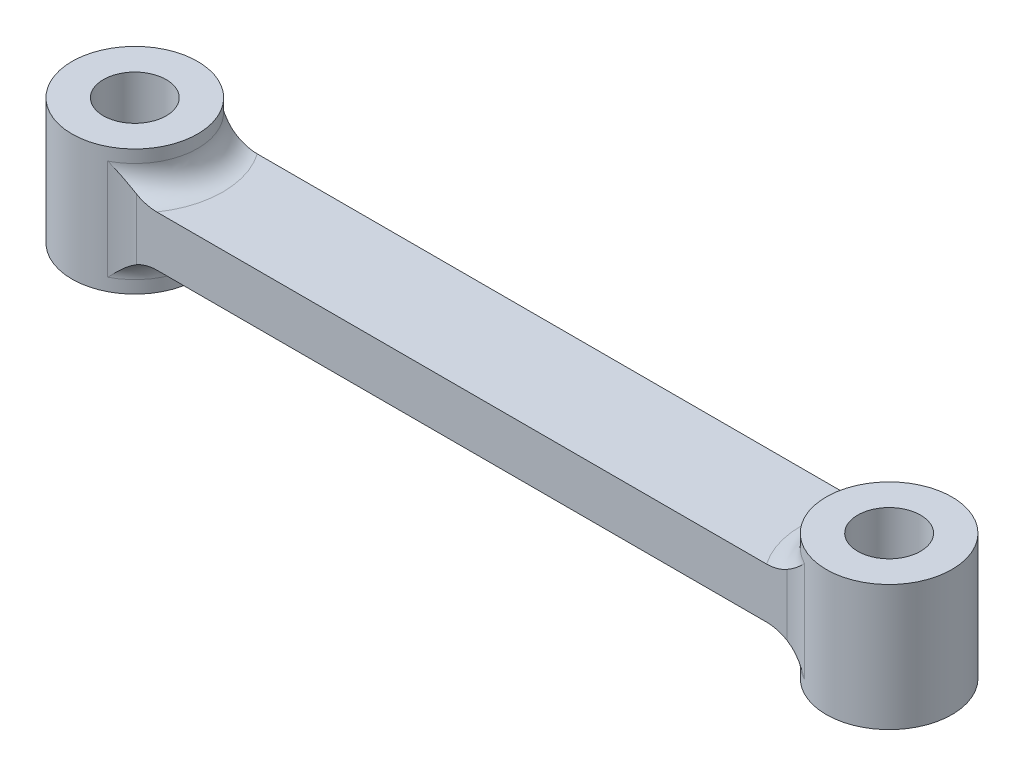
ISO-10303-21;
HEADER;
FILE_DESCRIPTION(('STEP AP214'),'2;1');
FILE_NAME('part.step','',(''),(''),'','','');
FILE_SCHEMA(('AUTOMOTIVE_DESIGN { 1 0 10303 214 1 1 1 1 }'));
ENDSEC;
DATA;
#1=APPLICATION_CONTEXT('core data for automotive mechanical design processes');
#2=APPLICATION_PROTOCOL_DEFINITION('international standard','automotive_design',2000,#1);
#3=PRODUCT_CONTEXT('',#1,'mechanical');
#4=PRODUCT('Part','Part','',(#3));
#5=PRODUCT_RELATED_PRODUCT_CATEGORY('part','',(#4));
#6=PRODUCT_DEFINITION_FORMATION('','',#4);
#7=PRODUCT_DEFINITION_CONTEXT('part definition',#1,'design');
#8=PRODUCT_DEFINITION('design','',#6,#7);
#9=PRODUCT_DEFINITION_SHAPE('','',#8);
#10=(LENGTH_UNIT() NAMED_UNIT(*) SI_UNIT(.MILLI.,.METRE.));
#11=(NAMED_UNIT(*) PLANE_ANGLE_UNIT() SI_UNIT($,.RADIAN.));
#12=(NAMED_UNIT(*) SI_UNIT($,.STERADIAN.) SOLID_ANGLE_UNIT());
#13=UNCERTAINTY_MEASURE_WITH_UNIT(LENGTH_MEASURE(1.E-05),#10,'distance_accuracy_value','');
#14=(GEOMETRIC_REPRESENTATION_CONTEXT(3) GLOBAL_UNCERTAINTY_ASSIGNED_CONTEXT((#13)) GLOBAL_UNIT_ASSIGNED_CONTEXT((#10,
#11,#12)) REPRESENTATION_CONTEXT('',''));
#15=CARTESIAN_POINT('',(0.,0.,0.));
#16=DIRECTION('',(0.,0.,1.));
#17=DIRECTION('',(1.,0.,0.));
#18=AXIS2_PLACEMENT_3D('',#15,#16,#17);
#19=CARTESIAN_POINT('',(0.,2.,0.));
#20=DIRECTION('',(0.,1.,0.));
#21=DIRECTION('',(0.,0.,1.));
#22=AXIS2_PLACEMENT_3D('',#19,#20,#21);
#23=PLANE('',#22);
#24=DIRECTION('',(-1.,0.,0.));
#25=VECTOR('',#24,1.);
#26=CARTESIAN_POINT('',(0.,2.,4.));
#27=LINE('',#26,#25);
#28=CARTESIAN_POINT('',(24.255437353462,2.,4.));
#29=VERTEX_POINT('',#28);
#30=CARTESIAN_POINT('',(-24.255437353462,2.,4.));
#31=VERTEX_POINT('',#30);
#32=EDGE_CURVE('E153',#29,#31,#27,.T.);
#33=ORIENTED_EDGE('',*,*,#32,.F.);
#34=CARTESIAN_POINT('',(30.,2.,0.));
#35=DIRECTION('',(0.,1.,0.));
#36=DIRECTION('',(0.,0.,1.));
#37=AXIS2_PLACEMENT_3D('',#34,#35,#36);
#38=CIRCLE('',#37,7.);
#39=CARTESIAN_POINT('',(24.255437353462,2.,-4.));
#40=VERTEX_POINT('',#39);
#41=EDGE_CURVE('E138',#29,#40,#38,.F.);
#42=ORIENTED_EDGE('',*,*,#41,.T.);
#43=DIRECTION('',(-1.,0.,0.));
#44=VECTOR('',#43,1.);
#45=CARTESIAN_POINT('',(0.,2.,-4.));
#46=LINE('',#45,#44);
#47=CARTESIAN_POINT('',(-24.255437353462,2.,-3.99999999999999));
#48=VERTEX_POINT('',#47);
#49=EDGE_CURVE('E150',#40,#48,#46,.T.);
#50=ORIENTED_EDGE('',*,*,#49,.T.);
#51=CARTESIAN_POINT('',(-30.,2.,0.));
#52=DIRECTION('',(0.,1.,0.));
#53=DIRECTION('',(0.,0.,1.));
#54=AXIS2_PLACEMENT_3D('',#51,#52,#53);
#55=CIRCLE('',#54,7.);
#56=EDGE_CURVE('E155',#48,#31,#55,.F.);
#57=ORIENTED_EDGE('',*,*,#56,.T.);
#58=EDGE_LOOP('',(#33,#42,#50,#57));
#59=FACE_BOUND('',#58,.T.);
#60=ADVANCED_FACE('F37',(#59),#23,.T.);
#61=CARTESIAN_POINT('',(0.,-2.,0.));
#62=DIRECTION('',(0.,1.,0.));
#63=DIRECTION('',(0.,0.,1.));
#64=AXIS2_PLACEMENT_3D('',#61,#62,#63);
#65=PLANE('',#64);
#66=DIRECTION('',(-1.,0.,0.));
#67=VECTOR('',#66,1.);
#68=CARTESIAN_POINT('',(0.,-2.,-4.));
#69=LINE('',#68,#67);
#70=CARTESIAN_POINT('',(24.255437353462,-2.,-4.));
#71=VERTEX_POINT('',#70);
#72=CARTESIAN_POINT('',(-24.255437353462,-2.,-3.99999999999999));
#73=VERTEX_POINT('',#72);
#74=EDGE_CURVE('E165',#71,#73,#69,.T.);
#75=ORIENTED_EDGE('',*,*,#74,.F.);
#76=CARTESIAN_POINT('',(30.,-2.,0.));
#77=DIRECTION('',(0.,1.,0.));
#78=DIRECTION('',(0.,0.,1.));
#79=AXIS2_PLACEMENT_3D('',#76,#77,#78);
#80=CIRCLE('',#79,7.);
#81=CARTESIAN_POINT('',(24.255437353462,-2.,4.));
#82=VERTEX_POINT('',#81);
#83=EDGE_CURVE('E195',#71,#82,#80,.T.);
#84=ORIENTED_EDGE('',*,*,#83,.T.);
#85=DIRECTION('',(-1.,0.,0.));
#86=VECTOR('',#85,1.);
#87=CARTESIAN_POINT('',(0.,-2.,4.));
#88=LINE('',#87,#86);
#89=CARTESIAN_POINT('',(-24.255437353462,-2.,4.));
#90=VERTEX_POINT('',#89);
#91=EDGE_CURVE('E160',#82,#90,#88,.T.);
#92=ORIENTED_EDGE('',*,*,#91,.T.);
#93=CARTESIAN_POINT('',(-30.,-2.,0.));
#94=DIRECTION('',(0.,1.,0.));
#95=DIRECTION('',(0.,0.,1.));
#96=AXIS2_PLACEMENT_3D('',#93,#94,#95);
#97=CIRCLE('',#96,7.);
#98=EDGE_CURVE('E193',#90,#73,#97,.T.);
#99=ORIENTED_EDGE('',*,*,#98,.T.);
#100=EDGE_LOOP('',(#75,#84,#92,#99));
#101=FACE_BOUND('',#100,.T.);
#102=ADVANCED_FACE('F356',(#101),#65,.F.);
#103=CARTESIAN_POINT('',(25.8768943743823,2.,-8.));
#104=DIRECTION('',(0.,-1.,0.));
#105=DIRECTION('',(0.,0.,-1.));
#106=AXIS2_PLACEMENT_3D('',#103,#104,#105);
#107=CYLINDRICAL_SURFACE('',#106,4.);
#108=DIRECTION('',(0.,-1.,0.));
#109=VECTOR('',#108,1.);
#110=CARTESIAN_POINT('',(27.7093857635458,2.,-4.44444444444445));
#111=LINE('',#110,#109);
#112=CARTESIAN_POINT('',(27.7093857635458,4.,-4.44444444444445));
#113=VERTEX_POINT('',#112);
#114=CARTESIAN_POINT('',(27.7093857635458,-4.,-4.44444444444445));
#115=VERTEX_POINT('',#114);
#116=EDGE_CURVE('E162',#113,#115,#111,.T.);
#117=ORIENTED_EDGE('',*,*,#116,.T.);
#118=CARTESIAN_POINT('',(25.8768943743823,-2.44311944853179,-4.));
#119=CARTESIAN_POINT('',(25.9297746648206,-2.47372776459844,-4.00000196993777));
#120=CARTESIAN_POINT('',(25.9820268535978,-2.50538292882221,-4.00104838152717));
#121=CARTESIAN_POINT('',(26.0852688929575,-2.57052552649921,-4.00509689372207));
#122=CARTESIAN_POINT('',(26.1362592907939,-2.60401214465675,-4.00809813049912));
#123=CARTESIAN_POINT('',(26.2871761873936,-2.70671865821983,-4.01981872665788));
#124=CARTESIAN_POINT('',(26.3852807237515,-2.77832197612055,-4.03125616453968));
#125=CARTESIAN_POINT('',(26.5763074819203,-2.92579459635884,-4.06044308734516));
#126=CARTESIAN_POINT('',(26.6692552234867,-3.00163828863825,-4.07815753405037));
#127=CARTESIAN_POINT('',(26.8510157261602,-3.15671370740922,-4.1193082213558));
#128=CARTESIAN_POINT('',(26.9398264535234,-3.23594706428874,-4.14274724151965));
#129=CARTESIAN_POINT('',(27.1458070001983,-3.42637903978097,-4.2045646515911));
#130=CARTESIAN_POINT('',(27.2613470152071,-3.53858309793674,-4.24526407735));
#131=CARTESIAN_POINT('',(27.4865322009621,-3.76503356044029,-4.33614964924116));
#132=CARTESIAN_POINT('',(27.596177317845,-3.87927998343696,-4.38633588203782));
#133=CARTESIAN_POINT('',(27.7053316291044,-3.99567410659977,-4.44235719341808));
#134=CARTESIAN_POINT('',(27.7073591464804,-3.99783705955152,-4.44339995935357));
#135=CARTESIAN_POINT('',(27.7093857635458,-4.,-4.44444444444444));
#136=B_SPLINE_CURVE_WITH_KNOTS('',3,(#118,#119,#120,#121,#122,#123,#124,#125,#126,#127,#128,
#129,#130,#131,#132,#133,#134,#135),.UNSPECIFIED.,.F.,.F.,(4,2,2,2,2,2,2,2,4),(0.,
0.18324758445202,0.366414247509591,0.731941901421137,1.09546051720547,1.45915599139702,
1.95707222813002,2.45499301367486,2.46442110590508),.UNSPECIFIED.);
#137=CARTESIAN_POINT('',(25.8768943743823,-2.44311944853179,-4.));
#138=VERTEX_POINT('',#137);
#139=EDGE_CURVE('E339',#115,#138,#136,.F.);
#140=ORIENTED_EDGE('',*,*,#139,.T.);
#141=DIRECTION('',(0.,-1.,0.));
#142=VECTOR('',#141,1.);
#143=CARTESIAN_POINT('',(25.8768943743823,2.,-4.));
#144=LINE('',#143,#142);
#145=CARTESIAN_POINT('',(25.8768943743823,2.44311944853179,-4.));
#146=VERTEX_POINT('',#145);
#147=EDGE_CURVE('E185',#146,#138,#144,.T.);
#148=ORIENTED_EDGE('',*,*,#147,.F.);
#149=CARTESIAN_POINT('',(25.8768943743823,2.44311944853179,-4.));
#150=CARTESIAN_POINT('',(25.9297746648206,2.47372776459844,-4.00000196993777));
#151=CARTESIAN_POINT('',(25.9820268535978,2.50538292882221,-4.00104838152717));
#152=CARTESIAN_POINT('',(26.0852688929575,2.57052552649921,-4.00509689372207));
#153=CARTESIAN_POINT('',(26.1362592907939,2.60401214465675,-4.00809813049912));
#154=CARTESIAN_POINT('',(26.2871761873936,2.70671865821983,-4.01981872665788));
#155=CARTESIAN_POINT('',(26.3852807237515,2.77832197612055,-4.03125616453968));
#156=CARTESIAN_POINT('',(26.5763074819203,2.92579459635884,-4.06044308734516));
#157=CARTESIAN_POINT('',(26.6692552234867,3.00163828863825,-4.07815753405037));
#158=CARTESIAN_POINT('',(26.8510157261602,3.15671370740922,-4.1193082213558));
#159=CARTESIAN_POINT('',(26.9398264535234,3.23594706428874,-4.14274724151965));
#160=CARTESIAN_POINT('',(27.1458070001983,3.42637903978097,-4.2045646515911));
#161=CARTESIAN_POINT('',(27.2613470152071,3.53858309793674,-4.24526407735));
#162=CARTESIAN_POINT('',(27.4865322009621,3.76503356044029,-4.33614964924116));
#163=CARTESIAN_POINT('',(27.596177317845,3.87927998343696,-4.38633588203782));
#164=CARTESIAN_POINT('',(27.7053316291044,3.99567410659977,-4.44235719341808));
#165=CARTESIAN_POINT('',(27.7073591464804,3.99783705955152,-4.44339995935357));
#166=CARTESIAN_POINT('',(27.7093857635458,4.,-4.44444444444444));
#167=B_SPLINE_CURVE_WITH_KNOTS('',3,(#149,#150,#151,#152,#153,#154,#155,#156,#157,#158,#159,
#160,#161,#162,#163,#164,#165,#166),.UNSPECIFIED.,.F.,.F.,(4,2,2,2,2,2,2,2,4),(0.,
0.18324758445202,0.366414247509591,0.731941901421137,1.09546051720547,1.45915599139702,
1.95707222813002,2.45499301367486,2.46442110590508),.UNSPECIFIED.);
#168=EDGE_CURVE('E141',#146,#113,#167,.T.);
#169=ORIENTED_EDGE('',*,*,#168,.T.);
#170=EDGE_LOOP('',(#117,#140,#148,#169));
#171=FACE_BOUND('',#170,.T.);
#172=ADVANCED_FACE('F353',(#171),#107,.F.);
#173=CARTESIAN_POINT('',(0.,2.,-4.));
#174=DIRECTION('',(0.,0.,1.));
#175=DIRECTION('',(1.,0.,0.));
#176=AXIS2_PLACEMENT_3D('',#173,#174,#175);
#177=PLANE('',#176);
#178=ORIENTED_EDGE('',*,*,#147,.T.);
#179=CARTESIAN_POINT('',(25.8768943743823,-2.44311944853179,-4.));
#180=CARTESIAN_POINT('',(25.8028940293543,-2.40031307907234,-4.));
#181=CARTESIAN_POINT('',(25.7272214194364,-2.36041710182163,-4.));
#182=CARTESIAN_POINT('',(25.573006448851,-2.28656396245982,-4.));
#183=CARTESIAN_POINT('',(25.4944633589237,-2.25260832237957,-4.));
#184=CARTESIAN_POINT('',(25.3366024661627,-2.19138938342797,-4.));
#185=CARTESIAN_POINT('',(25.2573309607058,-2.16400665989232,-4.));
#186=CARTESIAN_POINT('',(25.0969764276201,-2.11529280431822,-4.));
#187=CARTESIAN_POINT('',(25.0158938512238,-2.09396018263259,-4.));
#188=CARTESIAN_POINT('',(24.8235455766396,-2.05118194693289,-4.));
#189=CARTESIAN_POINT('',(24.711687895434,-2.03233200401126,-4.));
#190=CARTESIAN_POINT('',(24.4850643988364,-2.00666016952282,-4.));
#191=CARTESIAN_POINT('',(24.3702797277634,-2.00000586442007,-4.));
#192=CARTESIAN_POINT('',(24.255437353462,-2.,-4.));
#193=B_SPLINE_CURVE_WITH_KNOTS('',3,(#179,#180,#181,#182,#183,#184,#185,#186,#187,#188,#189,
#190,#191,#192),.UNSPECIFIED.,.F.,.F.,(4,2,2,2,2,2,4),(0.,0.256388070157113,0.512841736058818,
0.764206669153215,1.01550965770467,1.35514048823286,1.69940433873517),.UNSPECIFIED.);
#194=EDGE_CURVE('E341',#138,#71,#193,.T.);
#195=ORIENTED_EDGE('',*,*,#194,.T.);
#196=ORIENTED_EDGE('',*,*,#74,.T.);
#197=CARTESIAN_POINT('',(-24.255437353462,-2.,-3.99999999999999));
#198=CARTESIAN_POINT('',(-24.3411491011881,-2.00000698154822,-3.99999999999999));
#199=CARTESIAN_POINT('',(-24.4267964362276,-2.0037106976294,-3.99999999999999));
#200=CARTESIAN_POINT('',(-24.5974637365262,-2.01820468756952,-3.99999999999999));
#201=CARTESIAN_POINT('',(-24.6824839050069,-2.02899255385296,-3.99999999999999));
#202=CARTESIAN_POINT('',(-24.9325226619659,-2.07095213548474,-3.99999999999999));
#203=CARTESIAN_POINT('',(-25.0960262215751,-2.11175040809518,-3.99999999999999));
#204=CARTESIAN_POINT('',(-25.3627150807588,-2.19997661663279,-3.99999999999999));
#205=CARTESIAN_POINT('',(-25.4681394349545,-2.24087288772786,-3.99999999999999));
#206=CARTESIAN_POINT('',(-25.6234640900527,-2.31033453105478,-3.99999999999999));
#207=CARTESIAN_POINT('',(-25.6751050690071,-2.33503380760382,-3.99999999999999));
#208=CARTESIAN_POINT('',(-25.7770466371054,-2.3870897541493,-3.99999999999999));
#209=CARTESIAN_POINT('',(-25.8273468665345,-2.41444712833164,-3.99999999999999));
#210=CARTESIAN_POINT('',(-25.8768943743817,-2.44311944853382,-3.99999999999999));
#211=B_SPLINE_CURVE_WITH_KNOTS('',3,(#197,#198,#199,#200,#201,#202,#203,#204,#205,#206,#207,
#208,#209,#210),.UNSPECIFIED.,.F.,.F.,(4,2,2,2,2,2,4),(0.,0.256941042069846,0.513794806905946,
1.01710137669416,1.35580786664483,1.52746636151208,1.69917045696184),.UNSPECIFIED.);
#212=CARTESIAN_POINT('',(-25.8768943743823,-2.44311944853178,-3.99999999999999));
#213=VERTEX_POINT('',#212);
#214=EDGE_CURVE('E51',#73,#213,#211,.T.);
#215=ORIENTED_EDGE('',*,*,#214,.T.);
#216=DIRECTION('',(0.,-1.,0.));
#217=VECTOR('',#216,1.);
#218=CARTESIAN_POINT('',(-25.8768943743823,2.,-3.99999999999999));
#219=LINE('',#218,#217);
#220=CARTESIAN_POINT('',(-25.8768943743823,2.44311944853178,-3.99999999999999));
#221=VERTEX_POINT('',#220);
#222=EDGE_CURVE('E57',#221,#213,#219,.T.);
#223=ORIENTED_EDGE('',*,*,#222,.F.);
#224=CARTESIAN_POINT('',(-25.8768943743823,2.44311944853178,-3.99999999999999));
#225=CARTESIAN_POINT('',(-25.8028940293543,2.40031307907233,-3.99999999999999));
#226=CARTESIAN_POINT('',(-25.7272214194364,2.36041710182162,-3.99999999999999));
#227=CARTESIAN_POINT('',(-25.5730064488509,2.28656396245982,-3.99999999999999));
#228=CARTESIAN_POINT('',(-25.4944633589237,2.25260832237956,-3.99999999999999));
#229=CARTESIAN_POINT('',(-25.3366024661627,2.19138938342796,-3.99999999999999));
#230=CARTESIAN_POINT('',(-25.2573309607057,2.16400665989231,-3.99999999999999));
#231=CARTESIAN_POINT('',(-25.0969764276201,2.11529280431822,-3.99999999999999));
#232=CARTESIAN_POINT('',(-25.0158938512237,2.09396018263258,-3.99999999999999));
#233=CARTESIAN_POINT('',(-24.8235455766396,2.05118194693288,-3.99999999999999));
#234=CARTESIAN_POINT('',(-24.7116878954339,2.03233200401126,-3.99999999999999));
#235=CARTESIAN_POINT('',(-24.4850643988363,2.00666016952282,-3.99999999999999));
#236=CARTESIAN_POINT('',(-24.3702797277634,2.00000586442007,-3.99999999999999));
#237=CARTESIAN_POINT('',(-24.255437353462,2.,-3.99999999999999));
#238=B_SPLINE_CURVE_WITH_KNOTS('',3,(#224,#225,#226,#227,#228,#229,#230,#231,#232,#233,#234,
#235,#236,#237),.UNSPECIFIED.,.F.,.F.,(4,2,2,2,2,2,4),(0.,0.256388070157112,0.512841736058817,
0.764206669153221,1.01550965770467,1.35514048823286,1.69940433873516),.UNSPECIFIED.);
#239=EDGE_CURVE('E159',#221,#48,#238,.T.);
#240=ORIENTED_EDGE('',*,*,#239,.T.);
#241=ORIENTED_EDGE('',*,*,#49,.F.);
#242=CARTESIAN_POINT('',(24.255437353462,2.,-4.));
#243=CARTESIAN_POINT('',(24.3411491011881,2.00000698154822,-4.));
#244=CARTESIAN_POINT('',(24.4267964362276,2.0037106976294,-4.));
#245=CARTESIAN_POINT('',(24.5974637365262,2.01820468756952,-4.));
#246=CARTESIAN_POINT('',(24.6824839050069,2.02899255385296,-4.));
#247=CARTESIAN_POINT('',(24.9325226619659,2.07095213548474,-4.));
#248=CARTESIAN_POINT('',(25.0960262215751,2.11175040809518,-4.));
#249=CARTESIAN_POINT('',(25.3627150807588,2.1999766166328,-4.));
#250=CARTESIAN_POINT('',(25.4681394349545,2.24087288772786,-4.));
#251=CARTESIAN_POINT('',(25.6234640900528,2.31033453105478,-4.));
#252=CARTESIAN_POINT('',(25.6751050690071,2.33503380760382,-4.));
#253=CARTESIAN_POINT('',(25.7770466371055,2.38708975414931,-4.));
#254=CARTESIAN_POINT('',(25.8273468665346,2.41444712833165,-4.));
#255=CARTESIAN_POINT('',(25.8768943743817,2.44311944853383,-4.));
#256=B_SPLINE_CURVE_WITH_KNOTS('',3,(#242,#243,#244,#245,#246,#247,#248,#249,#250,#251,#252,
#253,#254,#255),.UNSPECIFIED.,.F.,.F.,(4,2,2,2,2,2,4),(0.,0.256941042069846,0.513794806905946,
1.01710137669416,1.35580786664484,1.52746636151209,1.69917045696186),.UNSPECIFIED.);
#257=EDGE_CURVE('E133',#40,#146,#256,.T.);
#258=ORIENTED_EDGE('',*,*,#257,.T.);
#259=EDGE_LOOP('',(#178,#195,#196,#215,#223,#240,#241,#258));
#260=FACE_BOUND('',#259,.T.);
#261=ADVANCED_FACE('F157',(#260),#177,.F.);
#262=CARTESIAN_POINT('',(-25.8768943743823,2.,-7.99999999999999));
#263=DIRECTION('',(0.,-1.,0.));
#264=DIRECTION('',(0.,0.,-1.));
#265=AXIS2_PLACEMENT_3D('',#262,#263,#264);
#266=CYLINDRICAL_SURFACE('',#265,4.);
#267=ORIENTED_EDGE('',*,*,#222,.T.);
#268=CARTESIAN_POINT('',(-25.8768943743823,-2.44311944853178,-3.99999999999999));
#269=CARTESIAN_POINT('',(-25.9297746648205,-2.47372776459836,-4.00000196993777));
#270=CARTESIAN_POINT('',(-25.9820268535975,-2.50538292882206,-4.00104838152716));
#271=CARTESIAN_POINT('',(-26.085268892957,-2.5705255264989,-4.00509689372203));
#272=CARTESIAN_POINT('',(-26.1362592907933,-2.60401214465637,-4.00809813049908));
#273=CARTESIAN_POINT('',(-26.2871761873928,-2.70671865821921,-4.01981872665779));
#274=CARTESIAN_POINT('',(-26.3852807237504,-2.77832197611977,-4.03125616453956));
#275=CARTESIAN_POINT('',(-26.5763074819193,-2.92579459635808,-4.06044308734497));
#276=CARTESIAN_POINT('',(-26.6692552234859,-3.0016382886377,-4.07815753405017));
#277=CARTESIAN_POINT('',(-26.8510157261598,-3.15671370740882,-4.11930822135573));
#278=CARTESIAN_POINT('',(-26.9398264535234,-3.23594706428828,-4.14274724151971));
#279=CARTESIAN_POINT('',(-27.145807000198,-3.42637903978134,-4.20456465159093));
#280=CARTESIAN_POINT('',(-27.2613470152057,-3.5385830979384,-4.24526407734929));
#281=CARTESIAN_POINT('',(-27.4865322009635,-3.76503356043866,-4.33614964924188));
#282=CARTESIAN_POINT('',(-27.5961773178503,-3.87927998343076,-4.38633588204051));
#283=CARTESIAN_POINT('',(-27.7053316291045,-3.99567410659954,-4.44235719341818));
#284=CARTESIAN_POINT('',(-27.7073591464805,-3.9978370595514,-4.44339995935362));
#285=CARTESIAN_POINT('',(-27.7093857635457,-4.,-4.44444444444444));
#286=B_SPLINE_CURVE_WITH_KNOTS('',3,(#268,#269,#270,#271,#272,#273,#274,#275,#276,#277,#278,
#279,#280,#281,#282,#283,#284,#285),.UNSPECIFIED.,.F.,.F.,(4,2,2,2,2,2,2,2,4),(0.,
0.183247584451605,0.366414247508766,0.731941901419648,1.09546051720474,1.45915599139701,
1.95707222813009,2.45499301367489,2.4644211059051),.UNSPECIFIED.);
#287=CARTESIAN_POINT('',(-27.7093857635457,-4.,-4.44444444444444));
#288=VERTEX_POINT('',#287);
#289=EDGE_CURVE('E11',#213,#288,#286,.T.);
#290=ORIENTED_EDGE('',*,*,#289,.T.);
#291=DIRECTION('',(0.,-1.,0.));
#292=VECTOR('',#291,1.);
#293=CARTESIAN_POINT('',(-27.7093857635457,2.,-4.44444444444444));
#294=LINE('',#293,#292);
#295=CARTESIAN_POINT('',(-27.7093857635457,4.,-4.44444444444444));
#296=VERTEX_POINT('',#295);
#297=EDGE_CURVE('E182',#296,#288,#294,.T.);
#298=ORIENTED_EDGE('',*,*,#297,.F.);
#299=CARTESIAN_POINT('',(-25.8768943743823,2.44311944853178,-3.99999999999999));
#300=CARTESIAN_POINT('',(-25.9297746648205,2.47372776459836,-4.00000196993777));
#301=CARTESIAN_POINT('',(-25.9820268535975,2.50538292882206,-4.00104838152716));
#302=CARTESIAN_POINT('',(-26.085268892957,2.5705255264989,-4.00509689372203));
#303=CARTESIAN_POINT('',(-26.1362592907933,2.60401214465637,-4.00809813049908));
#304=CARTESIAN_POINT('',(-26.2871761873928,2.70671865821921,-4.01981872665779));
#305=CARTESIAN_POINT('',(-26.3852807237504,2.77832197611977,-4.03125616453956));
#306=CARTESIAN_POINT('',(-26.5763074819193,2.92579459635808,-4.06044308734497));
#307=CARTESIAN_POINT('',(-26.6692552234859,3.0016382886377,-4.07815753405017));
#308=CARTESIAN_POINT('',(-26.8510157261598,3.15671370740882,-4.11930822135573));
#309=CARTESIAN_POINT('',(-26.9398264535234,3.23594706428828,-4.14274724151971));
#310=CARTESIAN_POINT('',(-27.145807000198,3.42637903978134,-4.20456465159093));
#311=CARTESIAN_POINT('',(-27.2613470152057,3.5385830979384,-4.24526407734929));
#312=CARTESIAN_POINT('',(-27.4865322009635,3.76503356043866,-4.33614964924188));
#313=CARTESIAN_POINT('',(-27.5961773178503,3.87927998343076,-4.38633588204051));
#314=CARTESIAN_POINT('',(-27.7053316291045,3.99567410659954,-4.44235719341818));
#315=CARTESIAN_POINT('',(-27.7073591464805,3.9978370595514,-4.44339995935362));
#316=CARTESIAN_POINT('',(-27.7093857635457,4.,-4.44444444444444));
#317=B_SPLINE_CURVE_WITH_KNOTS('',3,(#299,#300,#301,#302,#303,#304,#305,#306,#307,#308,#309,
#310,#311,#312,#313,#314,#315,#316),.UNSPECIFIED.,.F.,.F.,(4,2,2,2,2,2,2,2,4),(0.,
0.183247584451605,0.366414247508766,0.731941901419648,1.09546051720474,1.45915599139701,
1.95707222813009,2.45499301367489,2.4644211059051),.UNSPECIFIED.);
#318=EDGE_CURVE('E287',#296,#221,#317,.F.);
#319=ORIENTED_EDGE('',*,*,#318,.T.);
#320=EDGE_LOOP('',(#267,#290,#298,#319));
#321=FACE_BOUND('',#320,.T.);
#322=ADVANCED_FACE('F297',(#321),#266,.F.);
#323=CARTESIAN_POINT('',(-30.,2.,0.));
#324=DIRECTION('',(0.,-1.,0.));
#325=DIRECTION('',(0.,0.,-1.));
#326=AXIS2_PLACEMENT_3D('',#323,#324,#325);
#327=CYLINDRICAL_SURFACE('',#326,5.);
#328=DIRECTION('',(0.,-1.,0.));
#329=VECTOR('',#328,1.);
#330=CARTESIAN_POINT('',(-27.7093857635458,2.,4.44444444444445));
#331=LINE('',#330,#329);
#332=CARTESIAN_POINT('',(-27.7093857635458,4.,4.44444444444445));
#333=VERTEX_POINT('',#332);
#334=CARTESIAN_POINT('',(-27.7093857635458,-4.,4.44444444444445));
#335=VERTEX_POINT('',#334);
#336=EDGE_CURVE('E180',#333,#335,#331,.T.);
#337=ORIENTED_EDGE('',*,*,#336,.F.);
#338=CARTESIAN_POINT('',(-30.,4.,0.));
#339=DIRECTION('',(0.,1.,0.));
#340=DIRECTION('',(0.,0.,1.));
#341=AXIS2_PLACEMENT_3D('',#338,#339,#340);
#342=CIRCLE('',#341,5.);
#343=EDGE_CURVE('E144',#333,#296,#342,.T.);
#344=ORIENTED_EDGE('',*,*,#343,.T.);
#345=ORIENTED_EDGE('',*,*,#297,.T.);
#346=CARTESIAN_POINT('',(-30.,-4.,0.));
#347=DIRECTION('',(0.,1.,0.));
#348=DIRECTION('',(0.,0.,1.));
#349=AXIS2_PLACEMENT_3D('',#346,#347,#348);
#350=CIRCLE('',#349,5.);
#351=EDGE_CURVE('E197',#288,#335,#350,.F.);
#352=ORIENTED_EDGE('',*,*,#351,.T.);
#353=EDGE_LOOP('',(#337,#344,#345,#352));
#354=FACE_BOUND('',#353,.T.);
#355=CARTESIAN_POINT('',(-30.,-5.,0.));
#356=DIRECTION('',(0.,1.,0.));
#357=DIRECTION('',(0.,0.,1.));
#358=AXIS2_PLACEMENT_3D('',#355,#356,#357);
#359=CIRCLE('',#358,5.);
#360=CARTESIAN_POINT('',(-30.,-5.,5.));
#361=VERTEX_POINT('',#360);
#362=EDGE_CURVE('E168',#361,#361,#359,.T.);
#363=ORIENTED_EDGE('',*,*,#362,.T.);
#364=EDGE_LOOP('',(#363));
#365=FACE_BOUND('',#364,.T.);
#366=CARTESIAN_POINT('',(-30.,5.,0.));
#367=DIRECTION('',(0.,1.,0.));
#368=DIRECTION('',(0.,0.,1.));
#369=AXIS2_PLACEMENT_3D('',#366,#367,#368);
#370=CIRCLE('',#369,5.);
#371=CARTESIAN_POINT('',(-30.,5.,5.));
#372=VERTEX_POINT('',#371);
#373=EDGE_CURVE('E172',#372,#372,#370,.T.);
#374=ORIENTED_EDGE('',*,*,#373,.F.);
#375=EDGE_LOOP('',(#374));
#376=FACE_BOUND('',#375,.T.);
#377=ADVANCED_FACE('F301',(#354,#365,#376),#327,.T.);
#378=CARTESIAN_POINT('',(-25.8768943743824,2.,8.00000000000001));
#379=DIRECTION('',(0.,-1.,0.));
#380=DIRECTION('',(0.,0.,-1.));
#381=AXIS2_PLACEMENT_3D('',#378,#379,#380);
#382=CYLINDRICAL_SURFACE('',#381,4.);
#383=ORIENTED_EDGE('',*,*,#336,.T.);
#384=CARTESIAN_POINT('',(-25.8768943743824,-2.44311944853179,4.00000000000001));
#385=CARTESIAN_POINT('',(-25.9297746648206,-2.47372776459839,4.00000196993778));
#386=CARTESIAN_POINT('',(-25.9820268535976,-2.50538292882212,4.00104838152717));
#387=CARTESIAN_POINT('',(-26.0852688929572,-2.57052552649901,4.00509689372205));
#388=CARTESIAN_POINT('',(-26.1362592907936,-2.60401214465651,4.0080981304991));
#389=CARTESIAN_POINT('',(-26.2871761873931,-2.70671865821943,4.01981872665783));
#390=CARTESIAN_POINT('',(-26.3852807237508,-2.77832197612005,4.03125616453961));
#391=CARTESIAN_POINT('',(-26.5763074819197,-2.92579459635835,4.06044308734504));
#392=CARTESIAN_POINT('',(-26.6692552234862,-3.0016382886379,4.07815753405025));
#393=CARTESIAN_POINT('',(-26.85101572616,-3.15671370740897,4.11930822135577));
#394=CARTESIAN_POINT('',(-26.9398264535234,-3.23594706428846,4.1427472415197));
#395=CARTESIAN_POINT('',(-27.1458070001981,-3.42637903978123,4.204564651591));
#396=CARTESIAN_POINT('',(-27.2613470152062,-3.53858309793783,4.24526407734955));
#397=CARTESIAN_POINT('',(-27.486532200963,-3.76503356043922,4.33614964924163));
#398=CARTESIAN_POINT('',(-27.5961773178485,-3.8792799834329,4.38633588203957));
#399=CARTESIAN_POINT('',(-27.7053316291045,-3.99567410659961,4.44235719341814));
#400=CARTESIAN_POINT('',(-27.7073591464805,-3.99783705955144,4.44339995935361));
#401=CARTESIAN_POINT('',(-27.7093857635458,-4.,4.44444444444445));
#402=B_SPLINE_CURVE_WITH_KNOTS('',3,(#384,#385,#386,#387,#388,#389,#390,#391,#392,#393,#394,
#395,#396,#397,#398,#399,#400,#401),.UNSPECIFIED.,.F.,.F.,(4,2,2,2,2,2,2,2,4),(0.,
0.183247584451746,0.366414247509053,0.731941901420166,1.095460517205,1.45915599139702,
1.95707222813006,2.45499301367486,2.46442110590508),.UNSPECIFIED.);
#403=CARTESIAN_POINT('',(-25.8768943743824,-2.44311944853179,4.00000000000001));
#404=VERTEX_POINT('',#403);
#405=EDGE_CURVE('E310',#335,#404,#402,.F.);
#406=ORIENTED_EDGE('',*,*,#405,.T.);
#407=DIRECTION('',(0.,-1.,0.));
#408=VECTOR('',#407,1.);
#409=CARTESIAN_POINT('',(-25.8768943743824,2.,4.00000000000001));
#410=LINE('',#409,#408);
#411=CARTESIAN_POINT('',(-25.8768943743824,2.44311944853179,4.00000000000001));
#412=VERTEX_POINT('',#411);
#413=EDGE_CURVE('E65',#412,#404,#410,.T.);
#414=ORIENTED_EDGE('',*,*,#413,.F.);
#415=CARTESIAN_POINT('',(-25.8768943743824,2.44311944853179,4.00000000000001));
#416=CARTESIAN_POINT('',(-25.9297746648206,2.47372776459839,4.00000196993778));
#417=CARTESIAN_POINT('',(-25.9820268535976,2.50538292882212,4.00104838152717));
#418=CARTESIAN_POINT('',(-26.0852688929572,2.57052552649901,4.00509689372205));
#419=CARTESIAN_POINT('',(-26.1362592907936,2.60401214465651,4.0080981304991));
#420=CARTESIAN_POINT('',(-26.2871761873931,2.70671865821943,4.01981872665783));
#421=CARTESIAN_POINT('',(-26.3852807237508,2.77832197612005,4.03125616453961));
#422=CARTESIAN_POINT('',(-26.5763074819197,2.92579459635835,4.06044308734504));
#423=CARTESIAN_POINT('',(-26.6692552234862,3.0016382886379,4.07815753405025));
#424=CARTESIAN_POINT('',(-26.85101572616,3.15671370740897,4.11930822135577));
#425=CARTESIAN_POINT('',(-26.9398264535234,3.23594706428846,4.1427472415197));
#426=CARTESIAN_POINT('',(-27.1458070001981,3.42637903978123,4.204564651591));
#427=CARTESIAN_POINT('',(-27.2613470152062,3.53858309793783,4.24526407734955));
#428=CARTESIAN_POINT('',(-27.486532200963,3.76503356043922,4.33614964924163));
#429=CARTESIAN_POINT('',(-27.5961773178485,3.8792799834329,4.38633588203957));
#430=CARTESIAN_POINT('',(-27.7053316291045,3.99567410659961,4.44235719341814));
#431=CARTESIAN_POINT('',(-27.7073591464805,3.99783705955144,4.44339995935361));
#432=CARTESIAN_POINT('',(-27.7093857635458,4.,4.44444444444445));
#433=B_SPLINE_CURVE_WITH_KNOTS('',3,(#415,#416,#417,#418,#419,#420,#421,#422,#423,#424,#425,
#426,#427,#428,#429,#430,#431,#432),.UNSPECIFIED.,.F.,.F.,(4,2,2,2,2,2,2,2,4),(0.,
0.183247584451746,0.366414247509053,0.731941901420166,1.095460517205,1.45915599139702,
1.95707222813006,2.45499301367486,2.46442110590508),.UNSPECIFIED.);
#434=EDGE_CURVE('E273',#412,#333,#433,.T.);
#435=ORIENTED_EDGE('',*,*,#434,.T.);
#436=EDGE_LOOP('',(#383,#406,#414,#435));
#437=FACE_BOUND('',#436,.T.);
#438=ADVANCED_FACE('F304',(#437),#382,.F.);
#439=CARTESIAN_POINT('',(0.,2.,4.));
#440=DIRECTION('',(0.,0.,1.));
#441=DIRECTION('',(1.,0.,0.));
#442=AXIS2_PLACEMENT_3D('',#439,#440,#441);
#443=PLANE('',#442);
#444=ORIENTED_EDGE('',*,*,#91,.F.);
#445=CARTESIAN_POINT('',(24.255437353462,-2.,4.));
#446=CARTESIAN_POINT('',(24.3411491011881,-2.00000698154822,4.));
#447=CARTESIAN_POINT('',(24.4267964362276,-2.0037106976294,4.));
#448=CARTESIAN_POINT('',(24.5974637365262,-2.01820468756952,4.));
#449=CARTESIAN_POINT('',(24.6824839050069,-2.02899255385296,4.));
#450=CARTESIAN_POINT('',(24.9325226619659,-2.07095213548474,4.));
#451=CARTESIAN_POINT('',(25.0960262215751,-2.11175040809518,4.));
#452=CARTESIAN_POINT('',(25.3627150807588,-2.1999766166328,4.));
#453=CARTESIAN_POINT('',(25.4681394349545,-2.24087288772786,4.));
#454=CARTESIAN_POINT('',(25.6234640900527,-2.31033453105478,4.));
#455=CARTESIAN_POINT('',(25.6751050690071,-2.33503380760382,4.));
#456=CARTESIAN_POINT('',(25.7770466371054,-2.38708975414931,4.));
#457=CARTESIAN_POINT('',(25.8273468665346,-2.41444712833165,4.));
#458=CARTESIAN_POINT('',(25.8768943743817,-2.44311944853383,4.));
#459=B_SPLINE_CURVE_WITH_KNOTS('',3,(#445,#446,#447,#448,#449,#450,#451,#452,#453,#454,#455,
#456,#457,#458),.UNSPECIFIED.,.F.,.F.,(4,2,2,2,2,2,4),(0.,0.256941042069846,0.513794806905946,
1.01710137669416,1.35580786664483,1.52746636151209,1.69917045696185),.UNSPECIFIED.);
#460=CARTESIAN_POINT('',(25.8768943743823,-2.44311944853178,4.));
#461=VERTEX_POINT('',#460);
#462=EDGE_CURVE('E262',#82,#461,#459,.T.);
#463=ORIENTED_EDGE('',*,*,#462,.T.);
#464=DIRECTION('',(0.,-1.,0.));
#465=VECTOR('',#464,1.);
#466=CARTESIAN_POINT('',(25.8768943743823,2.,4.));
#467=LINE('',#466,#465);
#468=CARTESIAN_POINT('',(25.8768943743823,2.44311944853178,4.));
#469=VERTEX_POINT('',#468);
#470=EDGE_CURVE('E177',#469,#461,#467,.T.);
#471=ORIENTED_EDGE('',*,*,#470,.F.);
#472=CARTESIAN_POINT('',(25.8768943743823,2.44311944853178,4.));
#473=CARTESIAN_POINT('',(25.8028940293543,2.40031307907233,4.));
#474=CARTESIAN_POINT('',(25.7272214194364,2.36041710182163,4.));
#475=CARTESIAN_POINT('',(25.5730064488509,2.28656396245982,4.));
#476=CARTESIAN_POINT('',(25.4944633589237,2.25260832237956,4.));
#477=CARTESIAN_POINT('',(25.3366024661627,2.19138938342797,4.));
#478=CARTESIAN_POINT('',(25.2573309607058,2.16400665989231,4.));
#479=CARTESIAN_POINT('',(25.0969764276201,2.11529280431822,4.));
#480=CARTESIAN_POINT('',(25.0158938512237,2.09396018263259,4.));
#481=CARTESIAN_POINT('',(24.8235455766396,2.05118194693288,4.));
#482=CARTESIAN_POINT('',(24.7116878954339,2.03233200401126,4.));
#483=CARTESIAN_POINT('',(24.4850643988364,2.00666016952282,4.));
#484=CARTESIAN_POINT('',(24.3702797277634,2.00000586442007,4.));
#485=CARTESIAN_POINT('',(24.255437353462,2.,4.));
#486=B_SPLINE_CURVE_WITH_KNOTS('',3,(#472,#473,#474,#475,#476,#477,#478,#479,#480,#481,#482,
#483,#484,#485),.UNSPECIFIED.,.F.,.F.,(4,2,2,2,2,2,4),(0.,0.256388070157112,0.512841736058817,
0.764206669153214,1.01550965770467,1.35514048823285,1.69940433873516),.UNSPECIFIED.);
#487=EDGE_CURVE('E234',#469,#29,#486,.T.);
#488=ORIENTED_EDGE('',*,*,#487,.T.);
#489=ORIENTED_EDGE('',*,*,#32,.T.);
#490=CARTESIAN_POINT('',(-24.255437353462,2.,4.00000000000001));
#491=CARTESIAN_POINT('',(-24.3411491011881,2.00000698154822,4.));
#492=CARTESIAN_POINT('',(-24.4267964362276,2.0037106976294,4.));
#493=CARTESIAN_POINT('',(-24.5974637365262,2.01820468756952,4.));
#494=CARTESIAN_POINT('',(-24.6824839050069,2.02899255385296,4.));
#495=CARTESIAN_POINT('',(-24.9325226619659,2.07095213548474,4.));
#496=CARTESIAN_POINT('',(-25.0960262215751,2.11175040809518,4.));
#497=CARTESIAN_POINT('',(-25.3627150807588,2.1999766166328,4.));
#498=CARTESIAN_POINT('',(-25.4681394349545,2.24087288772786,4.));
#499=CARTESIAN_POINT('',(-25.6234640900528,2.31033453105478,4.));
#500=CARTESIAN_POINT('',(-25.6751050690071,2.33503380760382,4.));
#501=CARTESIAN_POINT('',(-25.7770466371055,2.38708975414931,4.));
#502=CARTESIAN_POINT('',(-25.8273468665346,2.41444712833165,4.));
#503=CARTESIAN_POINT('',(-25.8768943743817,2.44311944853383,4.));
#504=B_SPLINE_CURVE_WITH_KNOTS('',3,(#490,#491,#492,#493,#494,#495,#496,#497,#498,#499,#500,
#501,#502,#503),.UNSPECIFIED.,.F.,.F.,(4,2,2,2,2,2,4),(0.,0.256941042069843,0.513794806905946,
1.01710137669416,1.35580786664484,1.5274663615121,1.69917045696186),.UNSPECIFIED.);
#505=EDGE_CURVE('E261',#31,#412,#504,.T.);
#506=ORIENTED_EDGE('',*,*,#505,.T.);
#507=ORIENTED_EDGE('',*,*,#413,.T.);
#508=CARTESIAN_POINT('',(-25.8768943743824,-2.44311944853179,4.00000000000001));
#509=CARTESIAN_POINT('',(-25.8028940293543,-2.40031307907234,4.));
#510=CARTESIAN_POINT('',(-25.7272214194364,-2.36041710182163,4.));
#511=CARTESIAN_POINT('',(-25.573006448851,-2.28656396245983,4.));
#512=CARTESIAN_POINT('',(-25.4944633589237,-2.25260832237957,4.));
#513=CARTESIAN_POINT('',(-25.3366024661627,-2.19138938342797,4.));
#514=CARTESIAN_POINT('',(-25.2573309607058,-2.16400665989232,4.));
#515=CARTESIAN_POINT('',(-25.0969764276201,-2.11529280431822,4.));
#516=CARTESIAN_POINT('',(-25.0158938512238,-2.09396018263259,4.));
#517=CARTESIAN_POINT('',(-24.8235455766396,-2.05118194693289,4.));
#518=CARTESIAN_POINT('',(-24.711687895434,-2.03233200401126,4.));
#519=CARTESIAN_POINT('',(-24.4850643988364,-2.00666016952282,4.));
#520=CARTESIAN_POINT('',(-24.3702797277634,-2.00000586442007,4.));
#521=CARTESIAN_POINT('',(-24.255437353462,-2.,4.));
#522=B_SPLINE_CURVE_WITH_KNOTS('',3,(#508,#509,#510,#511,#512,#513,#514,#515,#516,#517,#518,
#519,#520,#521),.UNSPECIFIED.,.F.,.F.,(4,2,2,2,2,2,4),(0.,0.256388070157113,0.512841736058818,
0.764206669153215,1.01550965770467,1.35514048823286,1.69940433873518),.UNSPECIFIED.);
#523=EDGE_CURVE('E316',#404,#90,#522,.T.);
#524=ORIENTED_EDGE('',*,*,#523,.T.);
#525=EDGE_LOOP('',(#444,#463,#471,#488,#489,#506,#507,#524));
#526=FACE_BOUND('',#525,.T.);
#527=ADVANCED_FACE('F246',(#526),#443,.T.);
#528=CARTESIAN_POINT('',(25.8768943743823,2.,8.));
#529=DIRECTION('',(0.,-1.,0.));
#530=DIRECTION('',(0.,0.,-1.));
#531=AXIS2_PLACEMENT_3D('',#528,#529,#530);
#532=CYLINDRICAL_SURFACE('',#531,4.);
#533=ORIENTED_EDGE('',*,*,#470,.T.);
#534=CARTESIAN_POINT('',(25.8768943743823,-2.44311944853178,4.));
#535=CARTESIAN_POINT('',(25.9297746648205,-2.47372776459838,4.00000196993777));
#536=CARTESIAN_POINT('',(25.9820268535976,-2.5053829288221,4.00104838152716));
#537=CARTESIAN_POINT('',(26.0852688929571,-2.570525526499,4.00509689372204));
#538=CARTESIAN_POINT('',(26.1362592907935,-2.60401214465649,4.00809813049909));
#539=CARTESIAN_POINT('',(26.287176187393,-2.7067186582194,4.01981872665782));
#540=CARTESIAN_POINT('',(26.3852807237508,-2.77832197612002,4.0312561645396));
#541=CARTESIAN_POINT('',(26.5763074819196,-2.92579459635831,4.06044308734503));
#542=CARTESIAN_POINT('',(26.6692552234862,-3.00163828863787,4.07815753405023));
#543=CARTESIAN_POINT('',(26.85101572616,-3.15671370740894,4.11930822135576));
#544=CARTESIAN_POINT('',(26.9398264535234,-3.23594706428842,4.1427472415197));
#545=CARTESIAN_POINT('',(27.1458070001981,-3.42637903978124,4.20456465159098));
#546=CARTESIAN_POINT('',(27.2613470152061,-3.53858309793792,4.24526407734949));
#547=CARTESIAN_POINT('',(27.4865322009631,-3.76503356043913,4.33614964924168));
#548=CARTESIAN_POINT('',(27.5961773178488,-3.87927998343255,4.38633588203976));
#549=CARTESIAN_POINT('',(27.7053316291045,-3.9956741065996,4.44235719341815));
#550=CARTESIAN_POINT('',(27.7073591464805,-3.99783705955143,4.44339995935361));
#551=CARTESIAN_POINT('',(27.7093857635457,-4.,4.44444444444444));
#552=B_SPLINE_CURVE_WITH_KNOTS('',3,(#534,#535,#536,#537,#538,#539,#540,#541,#542,#543,#544,
#545,#546,#547,#548,#549,#550,#551),.UNSPECIFIED.,.F.,.F.,(4,2,2,2,2,2,2,2,4),(0.,
0.183247584451733,0.366414247509023,0.731941901420107,1.09546051720497,1.45915599139702,
1.95707222813007,2.45499301367488,2.46442110590509),.UNSPECIFIED.);
#553=CARTESIAN_POINT('',(27.7093857635457,-4.,4.44444444444444));
#554=VERTEX_POINT('',#553);
#555=EDGE_CURVE('E253',#461,#554,#552,.T.);
#556=ORIENTED_EDGE('',*,*,#555,.T.);
#557=DIRECTION('',(0.,-1.,0.));
#558=VECTOR('',#557,1.);
#559=CARTESIAN_POINT('',(27.7093857635457,2.,4.44444444444444));
#560=LINE('',#559,#558);
#561=CARTESIAN_POINT('',(27.7093857635457,4.,4.44444444444444));
#562=VERTEX_POINT('',#561);
#563=EDGE_CURVE('E175',#562,#554,#560,.T.);
#564=ORIENTED_EDGE('',*,*,#563,.F.);
#565=CARTESIAN_POINT('',(25.8768943743823,2.44311944853178,4.));
#566=CARTESIAN_POINT('',(25.9297746648205,2.47372776459838,4.00000196993777));
#567=CARTESIAN_POINT('',(25.9820268535976,2.5053829288221,4.00104838152716));
#568=CARTESIAN_POINT('',(26.0852688929571,2.570525526499,4.00509689372204));
#569=CARTESIAN_POINT('',(26.1362592907935,2.60401214465649,4.00809813049909));
#570=CARTESIAN_POINT('',(26.287176187393,2.7067186582194,4.01981872665782));
#571=CARTESIAN_POINT('',(26.3852807237508,2.77832197612001,4.0312561645396));
#572=CARTESIAN_POINT('',(26.5763074819196,2.92579459635831,4.06044308734503));
#573=CARTESIAN_POINT('',(26.6692552234862,3.00163828863787,4.07815753405023));
#574=CARTESIAN_POINT('',(26.85101572616,3.15671370740894,4.11930822135576));
#575=CARTESIAN_POINT('',(26.9398264535234,3.23594706428842,4.1427472415197));
#576=CARTESIAN_POINT('',(27.1458070001981,3.42637903978124,4.20456465159098));
#577=CARTESIAN_POINT('',(27.2613470152061,3.53858309793792,4.24526407734949));
#578=CARTESIAN_POINT('',(27.4865322009631,3.76503356043913,4.33614964924168));
#579=CARTESIAN_POINT('',(27.5961773178488,3.87927998343255,4.38633588203976));
#580=CARTESIAN_POINT('',(27.7053316291045,3.9956741065996,4.44235719341815));
#581=CARTESIAN_POINT('',(27.7073591464805,3.99783705955143,4.44339995935361));
#582=CARTESIAN_POINT('',(27.7093857635457,4.,4.44444444444444));
#583=B_SPLINE_CURVE_WITH_KNOTS('',3,(#565,#566,#567,#568,#569,#570,#571,#572,#573,#574,#575,
#576,#577,#578,#579,#580,#581,#582),.UNSPECIFIED.,.F.,.F.,(4,2,2,2,2,2,2,2,4),(0.,
0.183247584451733,0.366414247509023,0.731941901420107,1.09546051720497,1.45915599139702,
1.95707222813006,2.45499301367488,2.46442110590509),.UNSPECIFIED.);
#584=EDGE_CURVE('E227',#562,#469,#583,.F.);
#585=ORIENTED_EDGE('',*,*,#584,.T.);
#586=EDGE_LOOP('',(#533,#556,#564,#585));
#587=FACE_BOUND('',#586,.T.);
#588=ADVANCED_FACE('F241',(#587),#532,.F.);
#589=CARTESIAN_POINT('',(30.,2.,0.));
#590=DIRECTION('',(0.,-1.,0.));
#591=DIRECTION('',(0.,0.,-1.));
#592=AXIS2_PLACEMENT_3D('',#589,#590,#591);
#593=CYLINDRICAL_SURFACE('',#592,5.);
#594=ORIENTED_EDGE('',*,*,#116,.F.);
#595=CARTESIAN_POINT('',(30.,4.,0.));
#596=DIRECTION('',(0.,1.,0.));
#597=DIRECTION('',(0.,0.,1.));
#598=AXIS2_PLACEMENT_3D('',#595,#596,#597);
#599=CIRCLE('',#598,5.);
#600=EDGE_CURVE('E190',#113,#562,#599,.T.);
#601=ORIENTED_EDGE('',*,*,#600,.T.);
#602=ORIENTED_EDGE('',*,*,#563,.T.);
#603=CARTESIAN_POINT('',(30.,-4.,0.));
#604=DIRECTION('',(0.,1.,0.));
#605=DIRECTION('',(0.,0.,1.));
#606=AXIS2_PLACEMENT_3D('',#603,#604,#605);
#607=CIRCLE('',#606,5.);
#608=EDGE_CURVE('E154',#554,#115,#607,.F.);
#609=ORIENTED_EDGE('',*,*,#608,.T.);
#610=EDGE_LOOP('',(#594,#601,#602,#609));
#611=FACE_BOUND('',#610,.T.);
#612=CARTESIAN_POINT('',(30.,-5.,0.));
#613=DIRECTION('',(0.,1.,0.));
#614=DIRECTION('',(0.,0.,1.));
#615=AXIS2_PLACEMENT_3D('',#612,#613,#614);
#616=CIRCLE('',#615,5.);
#617=CARTESIAN_POINT('',(30.,-5.,5.));
#618=VERTEX_POINT('',#617);
#619=EDGE_CURVE('E395',#618,#618,#616,.T.);
#620=ORIENTED_EDGE('',*,*,#619,.T.);
#621=EDGE_LOOP('',(#620));
#622=FACE_BOUND('',#621,.T.);
#623=CARTESIAN_POINT('',(30.,5.,0.));
#624=DIRECTION('',(0.,1.,0.));
#625=DIRECTION('',(0.,0.,1.));
#626=AXIS2_PLACEMENT_3D('',#623,#624,#625);
#627=CIRCLE('',#626,5.);
#628=CARTESIAN_POINT('',(30.,5.,5.));
#629=VERTEX_POINT('',#628);
#630=EDGE_CURVE('E392',#629,#629,#627,.T.);
#631=ORIENTED_EDGE('',*,*,#630,.F.);
#632=EDGE_LOOP('',(#631));
#633=FACE_BOUND('',#632,.T.);
#634=ADVANCED_FACE('F245',(#611,#622,#633),#593,.T.);
#635=CARTESIAN_POINT('',(-30.,-5.,0.));
#636=DIRECTION('',(0.,1.,0.));
#637=DIRECTION('',(0.,0.,1.));
#638=AXIS2_PLACEMENT_3D('',#635,#636,#637);
#639=PLANE('',#638);
#640=ORIENTED_EDGE('',*,*,#362,.F.);
#641=EDGE_LOOP('',(#640));
#642=FACE_BOUND('',#641,.T.);
#643=CARTESIAN_POINT('',(-30.,-5.,0.));
#644=DIRECTION('',(0.,1.,0.));
#645=DIRECTION('',(0.,0.,1.));
#646=AXIS2_PLACEMENT_3D('',#643,#644,#645);
#647=CIRCLE('',#646,2.5);
#648=CARTESIAN_POINT('',(-30.,-5.,2.5));
#649=VERTEX_POINT('',#648);
#650=EDGE_CURVE('E385',#649,#649,#647,.T.);
#651=ORIENTED_EDGE('',*,*,#650,.T.);
#652=EDGE_LOOP('',(#651));
#653=FACE_BOUND('',#652,.T.);
#654=ADVANCED_FACE('F369',(#642,#653),#639,.F.);
#655=CARTESIAN_POINT('',(-30.,2.,0.));
#656=DIRECTION('',(0.,-1.,0.));
#657=DIRECTION('',(0.,0.,-1.));
#658=AXIS2_PLACEMENT_3D('',#655,#656,#657);
#659=CYLINDRICAL_SURFACE('',#658,2.5);
#660=ORIENTED_EDGE('',*,*,#650,.F.);
#661=EDGE_LOOP('',(#660));
#662=FACE_BOUND('',#661,.T.);
#663=CARTESIAN_POINT('',(-30.,5.,0.));
#664=DIRECTION('',(0.,1.,0.));
#665=DIRECTION('',(0.,0.,1.));
#666=AXIS2_PLACEMENT_3D('',#663,#664,#665);
#667=CIRCLE('',#666,2.5);
#668=CARTESIAN_POINT('',(-30.,5.,2.5));
#669=VERTEX_POINT('',#668);
#670=EDGE_CURVE('E388',#669,#669,#667,.T.);
#671=ORIENTED_EDGE('',*,*,#670,.T.);
#672=EDGE_LOOP('',(#671));
#673=FACE_BOUND('',#672,.T.);
#674=ADVANCED_FACE('F371',(#662,#673),#659,.F.);
#675=CARTESIAN_POINT('',(-30.,5.,0.));
#676=DIRECTION('',(0.,1.,0.));
#677=DIRECTION('',(0.,0.,1.));
#678=AXIS2_PLACEMENT_3D('',#675,#676,#677);
#679=PLANE('',#678);
#680=ORIENTED_EDGE('',*,*,#373,.T.);
#681=EDGE_LOOP('',(#680));
#682=FACE_BOUND('',#681,.T.);
#683=ORIENTED_EDGE('',*,*,#670,.F.);
#684=EDGE_LOOP('',(#683));
#685=FACE_BOUND('',#684,.T.);
#686=ADVANCED_FACE('F373',(#682,#685),#679,.T.);
#687=CARTESIAN_POINT('',(30.,-5.,0.));
#688=DIRECTION('',(0.,1.,0.));
#689=DIRECTION('',(0.,0.,1.));
#690=AXIS2_PLACEMENT_3D('',#687,#688,#689);
#691=PLANE('',#690);
#692=ORIENTED_EDGE('',*,*,#619,.F.);
#693=EDGE_LOOP('',(#692));
#694=FACE_BOUND('',#693,.T.);
#695=CARTESIAN_POINT('',(30.,-5.,0.));
#696=DIRECTION('',(0.,1.,0.));
#697=DIRECTION('',(0.,0.,1.));
#698=AXIS2_PLACEMENT_3D('',#695,#696,#697);
#699=CIRCLE('',#698,2.5);
#700=CARTESIAN_POINT('',(30.,-5.,2.5));
#701=VERTEX_POINT('',#700);
#702=EDGE_CURVE('E404',#701,#701,#699,.T.);
#703=ORIENTED_EDGE('',*,*,#702,.T.);
#704=EDGE_LOOP('',(#703));
#705=FACE_BOUND('',#704,.T.);
#706=ADVANCED_FACE('F379',(#694,#705),#691,.F.);
#707=CARTESIAN_POINT('',(30.,2.,0.));
#708=DIRECTION('',(0.,-1.,0.));
#709=DIRECTION('',(0.,0.,-1.));
#710=AXIS2_PLACEMENT_3D('',#707,#708,#709);
#711=CYLINDRICAL_SURFACE('',#710,2.5);
#712=ORIENTED_EDGE('',*,*,#702,.F.);
#713=EDGE_LOOP('',(#712));
#714=FACE_BOUND('',#713,.T.);
#715=CARTESIAN_POINT('',(30.,5.,0.));
#716=DIRECTION('',(0.,1.,0.));
#717=DIRECTION('',(0.,0.,1.));
#718=AXIS2_PLACEMENT_3D('',#715,#716,#717);
#719=CIRCLE('',#718,2.5);
#720=CARTESIAN_POINT('',(30.,5.,2.5));
#721=VERTEX_POINT('',#720);
#722=EDGE_CURVE('E401',#721,#721,#719,.T.);
#723=ORIENTED_EDGE('',*,*,#722,.T.);
#724=EDGE_LOOP('',(#723));
#725=FACE_BOUND('',#724,.T.);
#726=ADVANCED_FACE('F221',(#714,#725),#711,.F.);
#727=CARTESIAN_POINT('',(30.,5.,0.));
#728=DIRECTION('',(0.,1.,0.));
#729=DIRECTION('',(0.,0.,1.));
#730=AXIS2_PLACEMENT_3D('',#727,#728,#729);
#731=PLANE('',#730);
#732=ORIENTED_EDGE('',*,*,#630,.T.);
#733=EDGE_LOOP('',(#732));
#734=FACE_BOUND('',#733,.T.);
#735=ORIENTED_EDGE('',*,*,#722,.F.);
#736=EDGE_LOOP('',(#735));
#737=FACE_BOUND('',#736,.T.);
#738=ADVANCED_FACE('F220',(#734,#737),#731,.T.);
#739=CARTESIAN_POINT('',(30.,4.,0.));
#740=DIRECTION('',(0.,1.,0.));
#741=DIRECTION('',(0.,0.,1.));
#742=AXIS2_PLACEMENT_3D('',#739,#740,#741);
#743=TOROIDAL_SURFACE('',#742,7.,2.);
#744=ORIENTED_EDGE('',*,*,#584,.F.);
#745=ORIENTED_EDGE('',*,*,#600,.F.);
#746=ORIENTED_EDGE('',*,*,#168,.F.);
#747=ORIENTED_EDGE('',*,*,#257,.F.);
#748=ORIENTED_EDGE('',*,*,#41,.F.);
#749=ORIENTED_EDGE('',*,*,#487,.F.);
#750=EDGE_LOOP('',(#744,#745,#746,#747,#748,#749));
#751=FACE_BOUND('',#750,.T.);
#752=ADVANCED_FACE('F136',(#751),#743,.F.);
#753=CARTESIAN_POINT('',(30.,-4.,0.));
#754=DIRECTION('',(0.,1.,0.));
#755=DIRECTION('',(0.,0.,1.));
#756=AXIS2_PLACEMENT_3D('',#753,#754,#755);
#757=TOROIDAL_SURFACE('',#756,7.,2.);
#758=ORIENTED_EDGE('',*,*,#462,.F.);
#759=ORIENTED_EDGE('',*,*,#83,.F.);
#760=ORIENTED_EDGE('',*,*,#194,.F.);
#761=ORIENTED_EDGE('',*,*,#139,.F.);
#762=ORIENTED_EDGE('',*,*,#608,.F.);
#763=ORIENTED_EDGE('',*,*,#555,.F.);
#764=EDGE_LOOP('',(#758,#759,#760,#761,#762,#763));
#765=FACE_BOUND('',#764,.T.);
#766=ADVANCED_FACE('F219',(#765),#757,.F.);
#767=CARTESIAN_POINT('',(-30.,4.,0.));
#768=DIRECTION('',(0.,1.,0.));
#769=DIRECTION('',(0.,0.,1.));
#770=AXIS2_PLACEMENT_3D('',#767,#768,#769);
#771=TOROIDAL_SURFACE('',#770,7.,2.);
#772=ORIENTED_EDGE('',*,*,#318,.F.);
#773=ORIENTED_EDGE('',*,*,#343,.F.);
#774=ORIENTED_EDGE('',*,*,#434,.F.);
#775=ORIENTED_EDGE('',*,*,#505,.F.);
#776=ORIENTED_EDGE('',*,*,#56,.F.);
#777=ORIENTED_EDGE('',*,*,#239,.F.);
#778=EDGE_LOOP('',(#772,#773,#774,#775,#776,#777));
#779=FACE_BOUND('',#778,.T.);
#780=ADVANCED_FACE('F279',(#779),#771,.F.);
#781=CARTESIAN_POINT('',(-30.,-4.,0.));
#782=DIRECTION('',(0.,1.,0.));
#783=DIRECTION('',(0.,0.,1.));
#784=AXIS2_PLACEMENT_3D('',#781,#782,#783);
#785=TOROIDAL_SURFACE('',#784,7.,2.);
#786=ORIENTED_EDGE('',*,*,#214,.F.);
#787=ORIENTED_EDGE('',*,*,#98,.F.);
#788=ORIENTED_EDGE('',*,*,#523,.F.);
#789=ORIENTED_EDGE('',*,*,#405,.F.);
#790=ORIENTED_EDGE('',*,*,#351,.F.);
#791=ORIENTED_EDGE('',*,*,#289,.F.);
#792=EDGE_LOOP('',(#786,#787,#788,#789,#790,#791));
#793=FACE_BOUND('',#792,.T.);
#794=ADVANCED_FACE('F39',(#793),#785,.F.);
#795=CLOSED_SHELL('',(#60,#102,#172,#261,#322,#377,#438,#527,#588,#634,#654,#674,#686,#706,#726,
#738,#752,#766,#780,#794));
#796=MANIFOLD_SOLID_BREP('B2',#795);
#797=ADVANCED_BREP_SHAPE_REPRESENTATION('',(#18,#796),#14);
#798=SHAPE_DEFINITION_REPRESENTATION(#9,#797);
ENDSEC;
END-ISO-10303-21;
